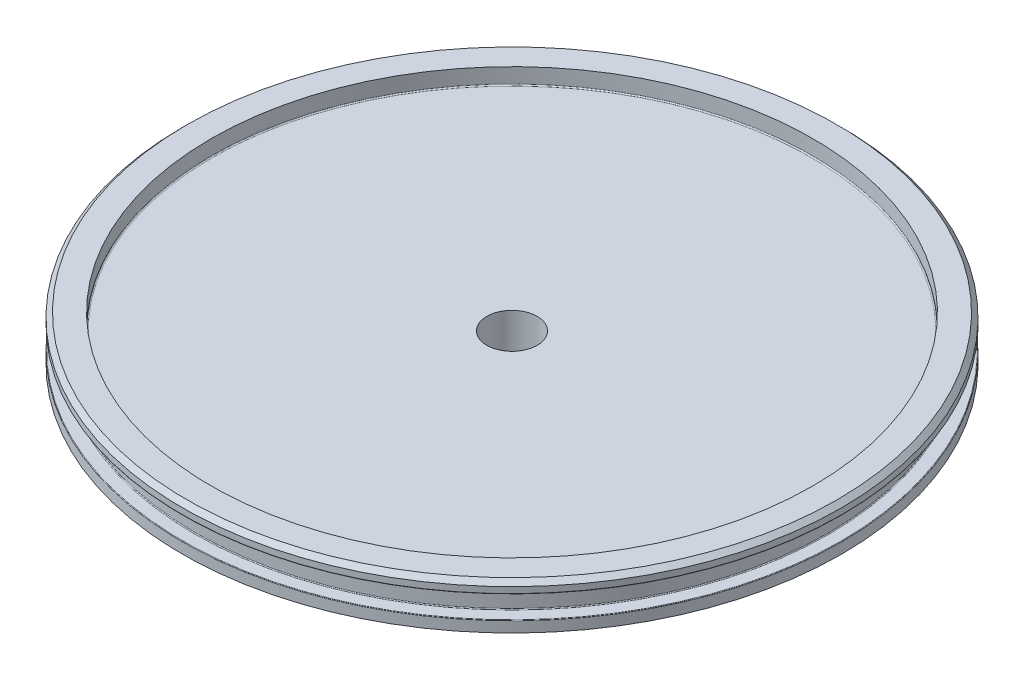
ISO-10303-21;
HEADER;
FILE_DESCRIPTION(('STEP AP214'),'2;1');
FILE_NAME('part.step','',(''),(''),'','','');
FILE_SCHEMA(('AUTOMOTIVE_DESIGN { 1 0 10303 214 1 1 1 1 }'));
ENDSEC;
DATA;
#1=APPLICATION_CONTEXT('core data for automotive mechanical design processes');
#2=APPLICATION_PROTOCOL_DEFINITION('international standard','automotive_design',2000,#1);
#3=PRODUCT_CONTEXT('',#1,'mechanical');
#4=PRODUCT('Part','Part','',(#3));
#5=PRODUCT_RELATED_PRODUCT_CATEGORY('part','',(#4));
#6=PRODUCT_DEFINITION_FORMATION('','',#4);
#7=PRODUCT_DEFINITION_CONTEXT('part definition',#1,'design');
#8=PRODUCT_DEFINITION('design','',#6,#7);
#9=PRODUCT_DEFINITION_SHAPE('','',#8);
#10=(LENGTH_UNIT() NAMED_UNIT(*) SI_UNIT(.MILLI.,.METRE.));
#11=(NAMED_UNIT(*) PLANE_ANGLE_UNIT() SI_UNIT($,.RADIAN.));
#12=(NAMED_UNIT(*) SI_UNIT($,.STERADIAN.) SOLID_ANGLE_UNIT());
#13=UNCERTAINTY_MEASURE_WITH_UNIT(LENGTH_MEASURE(1.E-05),#10,'distance_accuracy_value','');
#14=(GEOMETRIC_REPRESENTATION_CONTEXT(3) GLOBAL_UNCERTAINTY_ASSIGNED_CONTEXT((#13)) GLOBAL_UNIT_ASSIGNED_CONTEXT((#10,
#11,#12)) REPRESENTATION_CONTEXT('',''));
#15=CARTESIAN_POINT('',(0.,0.,0.));
#16=DIRECTION('',(0.,0.,1.));
#17=DIRECTION('',(1.,0.,0.));
#18=AXIS2_PLACEMENT_3D('',#15,#16,#17);
#19=CARTESIAN_POINT('',(0.,-2.54,0.));
#20=DIRECTION('',(0.,-1.,0.));
#21=DIRECTION('',(1.,0.,0.));
#22=AXIS2_PLACEMENT_3D('',#19,#20,#21);
#23=PLANE('',#22);
#24=CARTESIAN_POINT('',(0.,-2.54,0.));
#25=DIRECTION('',(0.,-1.,0.));
#26=DIRECTION('',(1.,0.,0.));
#27=AXIS2_PLACEMENT_3D('',#24,#25,#26);
#28=CIRCLE('',#27,65.913);
#29=CARTESIAN_POINT('',(65.913,-2.53999999999999,0.));
#30=VERTEX_POINT('',#29);
#31=EDGE_CURVE('E88',#30,#30,#28,.T.);
#32=ORIENTED_EDGE('',*,*,#31,.T.);
#33=EDGE_LOOP('',(#32));
#34=FACE_BOUND('',#33,.T.);
#35=CARTESIAN_POINT('',(0.,-2.54,0.));
#36=DIRECTION('',(0.,1.,0.));
#37=DIRECTION('',(0.,0.,1.));
#38=AXIS2_PLACEMENT_3D('',#35,#36,#37);
#39=CIRCLE('',#38,5.5626);
#40=CARTESIAN_POINT('',(0.,-2.54,5.5626));
#41=VERTEX_POINT('',#40);
#42=EDGE_CURVE('E124',#41,#41,#39,.T.);
#43=ORIENTED_EDGE('',*,*,#42,.T.);
#44=EDGE_LOOP('',(#43));
#45=FACE_BOUND('',#44,.T.);
#46=ADVANCED_FACE('F44',(#34,#45),#23,.T.);
#47=CARTESIAN_POINT('',(0.,0.,0.));
#48=DIRECTION('',(0.,1.,0.));
#49=DIRECTION('',(-1.,0.,0.));
#50=AXIS2_PLACEMENT_3D('',#47,#48,#49);
#51=PLANE('',#50);
#52=CARTESIAN_POINT('',(0.,0.,0.));
#53=DIRECTION('',(0.,1.,0.));
#54=DIRECTION('',(-1.,0.,0.));
#55=AXIS2_PLACEMENT_3D('',#52,#53,#54);
#56=CIRCLE('',#55,66.2178);
#57=CARTESIAN_POINT('',(-66.2178,0.,0.));
#58=VERTEX_POINT('',#57);
#59=EDGE_CURVE('E108',#58,#58,#56,.T.);
#60=ORIENTED_EDGE('',*,*,#59,.T.);
#61=EDGE_LOOP('',(#60));
#62=FACE_BOUND('',#61,.T.);
#63=CARTESIAN_POINT('',(0.,0.,0.));
#64=DIRECTION('',(0.,1.,0.));
#65=DIRECTION('',(-1.,0.,0.));
#66=AXIS2_PLACEMENT_3D('',#63,#64,#65);
#67=CIRCLE('',#66,72.898);
#68=CARTESIAN_POINT('',(-72.898,0.,0.));
#69=VERTEX_POINT('',#68);
#70=EDGE_CURVE('E116',#69,#69,#67,.T.);
#71=ORIENTED_EDGE('',*,*,#70,.F.);
#72=EDGE_LOOP('',(#71));
#73=FACE_BOUND('',#72,.T.);
#74=ADVANCED_FACE('F150',(#62,#73),#51,.F.);
#75=CARTESIAN_POINT('',(0.,48.1922132313012,0.));
#76=DIRECTION('',(0.,1.,0.));
#77=DIRECTION('',(-1.,0.,0.));
#78=AXIS2_PLACEMENT_3D('',#75,#76,#77);
#79=CYLINDRICAL_SURFACE('',#78,72.898);
#80=CARTESIAN_POINT('',(0.,2.33679999999999,0.));
#81=DIRECTION('',(0.,-1.,0.));
#82=DIRECTION('',(1.,0.,0.));
#83=AXIS2_PLACEMENT_3D('',#80,#81,#82);
#84=CIRCLE('',#83,72.898);
#85=CARTESIAN_POINT('',(72.898,2.3368,0.));
#86=VERTEX_POINT('',#85);
#87=EDGE_CURVE('E68',#86,#86,#84,.T.);
#88=ORIENTED_EDGE('',*,*,#87,.T.);
#89=EDGE_LOOP('',(#88));
#90=FACE_BOUND('',#89,.T.);
#91=ORIENTED_EDGE('',*,*,#70,.T.);
#92=EDGE_LOOP('',(#91));
#93=FACE_BOUND('',#92,.T.);
#94=ADVANCED_FACE('F158',(#90,#93),#79,.T.);
#95=CARTESIAN_POINT('',(72.898,2.4638,0.));
#96=DIRECTION('',(0.,-1.,0.));
#97=DIRECTION('',(1.,0.,0.));
#98=AXIS2_PLACEMENT_3D('',#95,#96,#97);
#99=PLANE('',#98);
#100=CARTESIAN_POINT('',(0.,2.46379999999999,0.));
#101=DIRECTION('',(0.,-1.,0.));
#102=DIRECTION('',(1.,0.,0.));
#103=AXIS2_PLACEMENT_3D('',#100,#101,#102);
#104=CIRCLE('',#103,72.771);
#105=CARTESIAN_POINT('',(72.771,2.4638,0.));
#106=VERTEX_POINT('',#105);
#107=EDGE_CURVE('E72',#106,#106,#104,.F.);
#108=ORIENTED_EDGE('',*,*,#107,.T.);
#109=EDGE_LOOP('',(#108));
#110=FACE_BOUND('',#109,.T.);
#111=CARTESIAN_POINT('',(0.,2.46379999999999,0.));
#112=DIRECTION('',(0.,-1.,0.));
#113=DIRECTION('',(1.,0.,0.));
#114=AXIS2_PLACEMENT_3D('',#111,#112,#113);
#115=CIRCLE('',#114,70.1548);
#116=CARTESIAN_POINT('',(70.1548,2.4638,0.));
#117=VERTEX_POINT('',#116);
#118=EDGE_CURVE('E92',#117,#117,#115,.T.);
#119=ORIENTED_EDGE('',*,*,#118,.T.);
#120=EDGE_LOOP('',(#119));
#121=FACE_BOUND('',#120,.T.);
#122=ADVANCED_FACE('F228',(#110,#121),#99,.F.);
#123=CARTESIAN_POINT('',(0.,48.1922132313012,0.));
#124=DIRECTION('',(0.,1.,0.));
#125=DIRECTION('',(-1.,0.,0.));
#126=AXIS2_PLACEMENT_3D('',#123,#124,#125);
#127=CYLINDRICAL_SURFACE('',#126,69.977);
#128=CARTESIAN_POINT('',(0.,7.26439999999999,0.));
#129=DIRECTION('',(0.,1.,0.));
#130=DIRECTION('',(-1.,0.,0.));
#131=AXIS2_PLACEMENT_3D('',#128,#129,#130);
#132=CIRCLE('',#131,69.977);
#133=CARTESIAN_POINT('',(-69.977,7.26439999999998,0.));
#134=VERTEX_POINT('',#133);
#135=EDGE_CURVE('E96',#134,#134,#132,.F.);
#136=ORIENTED_EDGE('',*,*,#135,.T.);
#137=EDGE_LOOP('',(#136));
#138=FACE_BOUND('',#137,.T.);
#139=CARTESIAN_POINT('',(0.,2.64159999999999,0.));
#140=DIRECTION('',(0.,-1.,0.));
#141=DIRECTION('',(1.,0.,0.));
#142=AXIS2_PLACEMENT_3D('',#139,#140,#141);
#143=CIRCLE('',#142,69.977);
#144=CARTESIAN_POINT('',(69.977,2.6416,0.));
#145=VERTEX_POINT('',#144);
#146=EDGE_CURVE('E100',#145,#145,#143,.F.);
#147=ORIENTED_EDGE('',*,*,#146,.T.);
#148=EDGE_LOOP('',(#147));
#149=FACE_BOUND('',#148,.T.);
#150=ADVANCED_FACE('F225',(#138,#149),#127,.T.);
#151=CARTESIAN_POINT('',(69.977,7.4422,0.));
#152=DIRECTION('',(0.,1.,0.));
#153=DIRECTION('',(-1.,0.,0.));
#154=AXIS2_PLACEMENT_3D('',#151,#152,#153);
#155=PLANE('',#154);
#156=CARTESIAN_POINT('',(0.,7.44219999999999,0.));
#157=DIRECTION('',(0.,1.,0.));
#158=DIRECTION('',(-1.,0.,0.));
#159=AXIS2_PLACEMENT_3D('',#156,#157,#158);
#160=CIRCLE('',#159,72.771);
#161=CARTESIAN_POINT('',(-72.771,7.44219999999998,0.));
#162=VERTEX_POINT('',#161);
#163=EDGE_CURVE('E76',#162,#162,#160,.F.);
#164=ORIENTED_EDGE('',*,*,#163,.T.);
#165=EDGE_LOOP('',(#164));
#166=FACE_BOUND('',#165,.T.);
#167=CARTESIAN_POINT('',(0.,7.44219999999999,0.));
#168=DIRECTION('',(0.,1.,0.));
#169=DIRECTION('',(-1.,0.,0.));
#170=AXIS2_PLACEMENT_3D('',#167,#168,#169);
#171=CIRCLE('',#170,70.1548);
#172=CARTESIAN_POINT('',(-70.1548,7.44219999999998,0.));
#173=VERTEX_POINT('',#172);
#174=EDGE_CURVE('E104',#173,#173,#171,.T.);
#175=ORIENTED_EDGE('',*,*,#174,.T.);
#176=EDGE_LOOP('',(#175));
#177=FACE_BOUND('',#176,.T.);
#178=ADVANCED_FACE('F219',(#166,#177),#155,.F.);
#179=CARTESIAN_POINT('',(0.,48.1922132313012,0.));
#180=DIRECTION('',(0.,1.,0.));
#181=DIRECTION('',(-1.,0.,0.));
#182=AXIS2_PLACEMENT_3D('',#179,#180,#181);
#183=CYLINDRICAL_SURFACE('',#182,72.898);
#184=CARTESIAN_POINT('',(0.,8.88999999999989,0.));
#185=DIRECTION('',(0.,-1.,0.));
#186=DIRECTION('',(1.,0.,0.));
#187=AXIS2_PLACEMENT_3D('',#184,#185,#186);
#188=CIRCLE('',#187,72.898);
#189=CARTESIAN_POINT('',(72.898,8.8899999999999,0.));
#190=VERTEX_POINT('',#189);
#191=EDGE_CURVE('E57',#190,#190,#188,.T.);
#192=ORIENTED_EDGE('',*,*,#191,.T.);
#193=EDGE_LOOP('',(#192));
#194=FACE_BOUND('',#193,.T.);
#195=CARTESIAN_POINT('',(0.,7.56919999999999,0.));
#196=DIRECTION('',(0.,1.,0.));
#197=DIRECTION('',(-1.,0.,0.));
#198=AXIS2_PLACEMENT_3D('',#195,#196,#197);
#199=CIRCLE('',#198,72.898);
#200=CARTESIAN_POINT('',(-72.898,7.56919999999998,0.));
#201=VERTEX_POINT('',#200);
#202=EDGE_CURVE('E80',#201,#201,#199,.T.);
#203=ORIENTED_EDGE('',*,*,#202,.T.);
#204=EDGE_LOOP('',(#203));
#205=FACE_BOUND('',#204,.T.);
#206=ADVANCED_FACE('F212',(#194,#205),#183,.T.);
#207=CARTESIAN_POINT('',(72.898,9.906,0.));
#208=DIRECTION('',(0.,-1.,0.));
#209=DIRECTION('',(1.,0.,0.));
#210=AXIS2_PLACEMENT_3D('',#207,#208,#209);
#211=PLANE('',#210);
#212=CARTESIAN_POINT('',(0.,9.90599999999999,0.));
#213=DIRECTION('',(0.,-1.,0.));
#214=DIRECTION('',(1.,0.,0.));
#215=AXIS2_PLACEMENT_3D('',#212,#213,#214);
#216=CIRCLE('',#215,71.8819999999999);
#217=CARTESIAN_POINT('',(71.8819999999999,9.906,0.));
#218=VERTEX_POINT('',#217);
#219=EDGE_CURVE('E62',#218,#218,#216,.F.);
#220=ORIENTED_EDGE('',*,*,#219,.T.);
#221=EDGE_LOOP('',(#220));
#222=FACE_BOUND('',#221,.T.);
#223=CARTESIAN_POINT('',(0.,9.90599999999999,0.));
#224=DIRECTION('',(0.,1.,0.));
#225=DIRECTION('',(-1.,0.,0.));
#226=AXIS2_PLACEMENT_3D('',#223,#224,#225);
#227=CIRCLE('',#226,66.548);
#228=CARTESIAN_POINT('',(-66.548,9.90599999999998,0.));
#229=VERTEX_POINT('',#228);
#230=EDGE_CURVE('E120',#229,#229,#227,.T.);
#231=ORIENTED_EDGE('',*,*,#230,.F.);
#232=EDGE_LOOP('',(#231));
#233=FACE_BOUND('',#232,.T.);
#234=ADVANCED_FACE('F147',(#222,#233),#211,.F.);
#235=CARTESIAN_POINT('',(0.,48.1922132313012,0.));
#236=DIRECTION('',(0.,1.,0.));
#237=DIRECTION('',(-1.,0.,0.));
#238=AXIS2_PLACEMENT_3D('',#235,#236,#237);
#239=CYLINDRICAL_SURFACE('',#238,66.548);
#240=CARTESIAN_POINT('',(0.,6.604,0.));
#241=DIRECTION('',(0.,-1.,0.));
#242=DIRECTION('',(1.,0.,0.));
#243=AXIS2_PLACEMENT_3D('',#240,#241,#242);
#244=CIRCLE('',#243,66.548);
#245=CARTESIAN_POINT('',(66.548,6.60400000000001,0.));
#246=VERTEX_POINT('',#245);
#247=EDGE_CURVE('E10',#246,#246,#244,.T.);
#248=ORIENTED_EDGE('',*,*,#247,.T.);
#249=EDGE_LOOP('',(#248));
#250=FACE_BOUND('',#249,.T.);
#251=ORIENTED_EDGE('',*,*,#230,.T.);
#252=EDGE_LOOP('',(#251));
#253=FACE_BOUND('',#252,.T.);
#254=ADVANCED_FACE('F138',(#250,#253),#239,.F.);
#255=CARTESIAN_POINT('',(66.548,6.35,0.));
#256=DIRECTION('',(0.,-1.,0.));
#257=DIRECTION('',(1.,0.,0.));
#258=AXIS2_PLACEMENT_3D('',#255,#256,#257);
#259=PLANE('',#258);
#260=CARTESIAN_POINT('',(0.,6.35,0.));
#261=DIRECTION('',(0.,-1.,0.));
#262=DIRECTION('',(1.,0.,0.));
#263=AXIS2_PLACEMENT_3D('',#260,#261,#262);
#264=CIRCLE('',#263,66.294);
#265=CARTESIAN_POINT('',(66.294,6.35,0.));
#266=VERTEX_POINT('',#265);
#267=EDGE_CURVE('E52',#266,#266,#264,.F.);
#268=ORIENTED_EDGE('',*,*,#267,.T.);
#269=EDGE_LOOP('',(#268));
#270=FACE_BOUND('',#269,.T.);
#271=CARTESIAN_POINT('',(0.,6.35,0.));
#272=DIRECTION('',(0.,1.,0.));
#273=DIRECTION('',(0.,0.,1.));
#274=AXIS2_PLACEMENT_3D('',#271,#272,#273);
#275=CIRCLE('',#274,5.56259999999999);
#276=CARTESIAN_POINT('',(0.,6.35,5.56259999999999));
#277=VERTEX_POINT('',#276);
#278=EDGE_CURVE('E128',#277,#277,#275,.T.);
#279=ORIENTED_EDGE('',*,*,#278,.F.);
#280=EDGE_LOOP('',(#279));
#281=FACE_BOUND('',#280,.T.);
#282=ADVANCED_FACE('F135',(#270,#281),#259,.F.);
#283=CARTESIAN_POINT('',(0.,-2.54,0.));
#284=DIRECTION('',(0.,1.,0.));
#285=DIRECTION('',(-1.,0.,0.));
#286=AXIS2_PLACEMENT_3D('',#283,#284,#285);
#287=CYLINDRICAL_SURFACE('',#286,66.04);
#288=CARTESIAN_POINT('',(0.,-2.413,0.));
#289=DIRECTION('',(0.,-1.,0.));
#290=DIRECTION('',(1.,0.,0.));
#291=AXIS2_PLACEMENT_3D('',#288,#289,#290);
#292=CIRCLE('',#291,66.04);
#293=CARTESIAN_POINT('',(66.04,-2.41299999999999,0.));
#294=VERTEX_POINT('',#293);
#295=EDGE_CURVE('E84',#294,#294,#292,.F.);
#296=ORIENTED_EDGE('',*,*,#295,.T.);
#297=EDGE_LOOP('',(#296));
#298=FACE_BOUND('',#297,.T.);
#299=CARTESIAN_POINT('',(0.,-0.177800000000004,0.));
#300=DIRECTION('',(0.,1.,0.));
#301=DIRECTION('',(-1.,0.,0.));
#302=AXIS2_PLACEMENT_3D('',#299,#300,#301);
#303=CIRCLE('',#302,66.04);
#304=CARTESIAN_POINT('',(-66.04,-0.177800000000012,0.));
#305=VERTEX_POINT('',#304);
#306=EDGE_CURVE('E112',#305,#305,#303,.F.);
#307=ORIENTED_EDGE('',*,*,#306,.T.);
#308=EDGE_LOOP('',(#307));
#309=FACE_BOUND('',#308,.T.);
#310=ADVANCED_FACE('F137',(#298,#309),#287,.T.);
#311=CARTESIAN_POINT('',(0.,6.35,0.));
#312=DIRECTION('',(0.,1.,0.));
#313=DIRECTION('',(0.,0.,1.));
#314=AXIS2_PLACEMENT_3D('',#311,#312,#313);
#315=CYLINDRICAL_SURFACE('',#314,5.56259999999999);
#316=ORIENTED_EDGE('',*,*,#42,.F.);
#317=EDGE_LOOP('',(#316));
#318=FACE_BOUND('',#317,.T.);
#319=ORIENTED_EDGE('',*,*,#278,.T.);
#320=EDGE_LOOP('',(#319));
#321=FACE_BOUND('',#320,.T.);
#322=ADVANCED_FACE('F133',(#318,#321),#315,.F.);
#323=CARTESIAN_POINT('',(0.,-0.177800000000004,0.));
#324=DIRECTION('',(0.,1.,0.));
#325=DIRECTION('',(-1.,0.,0.));
#326=AXIS2_PLACEMENT_3D('',#323,#324,#325);
#327=TOROIDAL_SURFACE('',#326,66.2178,0.1778);
#328=ORIENTED_EDGE('',*,*,#59,.F.);
#329=EDGE_LOOP('',(#328));
#330=FACE_BOUND('',#329,.T.);
#331=ORIENTED_EDGE('',*,*,#306,.F.);
#332=EDGE_LOOP('',(#331));
#333=FACE_BOUND('',#332,.T.);
#334=ADVANCED_FACE('F164',(#330,#333),#327,.F.);
#335=CARTESIAN_POINT('',(0.,7.26439999999999,0.));
#336=DIRECTION('',(0.,1.,0.));
#337=DIRECTION('',(-1.,0.,0.));
#338=AXIS2_PLACEMENT_3D('',#335,#336,#337);
#339=TOROIDAL_SURFACE('',#338,70.1548,0.1778);
#340=ORIENTED_EDGE('',*,*,#135,.F.);
#341=EDGE_LOOP('',(#340));
#342=FACE_BOUND('',#341,.T.);
#343=ORIENTED_EDGE('',*,*,#174,.F.);
#344=EDGE_LOOP('',(#343));
#345=FACE_BOUND('',#344,.T.);
#346=ADVANCED_FACE('F169',(#342,#345),#339,.F.);
#347=CARTESIAN_POINT('',(0.,2.64159999999999,0.));
#348=DIRECTION('',(0.,-1.,0.));
#349=DIRECTION('',(1.,0.,0.));
#350=AXIS2_PLACEMENT_3D('',#347,#348,#349);
#351=TOROIDAL_SURFACE('',#350,70.1548,0.1778);
#352=ORIENTED_EDGE('',*,*,#118,.F.);
#353=EDGE_LOOP('',(#352));
#354=FACE_BOUND('',#353,.T.);
#355=ORIENTED_EDGE('',*,*,#146,.F.);
#356=EDGE_LOOP('',(#355));
#357=FACE_BOUND('',#356,.T.);
#358=ADVANCED_FACE('F177',(#354,#357),#351,.F.);
#359=CARTESIAN_POINT('',(0.,-2.413,0.));
#360=DIRECTION('',(0.,-1.,0.));
#361=DIRECTION('',(1.,0.,0.));
#362=AXIS2_PLACEMENT_3D('',#359,#360,#361);
#363=TOROIDAL_SURFACE('',#362,65.913,0.127);
#364=ORIENTED_EDGE('',*,*,#295,.F.);
#365=EDGE_LOOP('',(#364));
#366=FACE_BOUND('',#365,.T.);
#367=ORIENTED_EDGE('',*,*,#31,.F.);
#368=EDGE_LOOP('',(#367));
#369=FACE_BOUND('',#368,.T.);
#370=ADVANCED_FACE('F185',(#366,#369),#363,.T.);
#371=CARTESIAN_POINT('',(0.,7.56919999999999,0.));
#372=DIRECTION('',(0.,1.,0.));
#373=DIRECTION('',(-1.,0.,0.));
#374=AXIS2_PLACEMENT_3D('',#371,#372,#373);
#375=TOROIDAL_SURFACE('',#374,72.771,0.127);
#376=ORIENTED_EDGE('',*,*,#163,.F.);
#377=EDGE_LOOP('',(#376));
#378=FACE_BOUND('',#377,.T.);
#379=ORIENTED_EDGE('',*,*,#202,.F.);
#380=EDGE_LOOP('',(#379));
#381=FACE_BOUND('',#380,.T.);
#382=ADVANCED_FACE('F189',(#378,#381),#375,.T.);
#383=CARTESIAN_POINT('',(0.,2.33679999999999,0.));
#384=DIRECTION('',(0.,-1.,0.));
#385=DIRECTION('',(1.,0.,0.));
#386=AXIS2_PLACEMENT_3D('',#383,#384,#385);
#387=TOROIDAL_SURFACE('',#386,72.771,0.127);
#388=ORIENTED_EDGE('',*,*,#87,.F.);
#389=EDGE_LOOP('',(#388));
#390=FACE_BOUND('',#389,.T.);
#391=ORIENTED_EDGE('',*,*,#107,.F.);
#392=EDGE_LOOP('',(#391));
#393=FACE_BOUND('',#392,.T.);
#394=ADVANCED_FACE('F193',(#390,#393),#387,.T.);
#395=CARTESIAN_POINT('',(0.,9.90599999999999,0.));
#396=DIRECTION('',(0.,-1.,0.));
#397=DIRECTION('',(1.,0.,0.));
#398=AXIS2_PLACEMENT_3D('',#395,#396,#397);
#399=CONICAL_SURFACE('',#398,71.8819999999999,0.785398163397448);
#400=ORIENTED_EDGE('',*,*,#191,.F.);
#401=EDGE_LOOP('',(#400));
#402=FACE_BOUND('',#401,.T.);
#403=ORIENTED_EDGE('',*,*,#219,.F.);
#404=EDGE_LOOP('',(#403));
#405=FACE_BOUND('',#404,.T.);
#406=ADVANCED_FACE('F196',(#402,#405),#399,.T.);
#407=CARTESIAN_POINT('',(0.,6.604,0.));
#408=DIRECTION('',(0.,-1.,0.));
#409=DIRECTION('',(1.,0.,0.));
#410=AXIS2_PLACEMENT_3D('',#407,#408,#409);
#411=TOROIDAL_SURFACE('',#410,66.294,0.254);
#412=ORIENTED_EDGE('',*,*,#247,.F.);
#413=EDGE_LOOP('',(#412));
#414=FACE_BOUND('',#413,.T.);
#415=ORIENTED_EDGE('',*,*,#267,.F.);
#416=EDGE_LOOP('',(#415));
#417=FACE_BOUND('',#416,.T.);
#418=ADVANCED_FACE('F46',(#414,#417),#411,.F.);
#419=CLOSED_SHELL('',(#46,#74,#94,#122,#150,#178,#206,#234,#254,#282,#310,#322,#334,#346,#358,
#370,#382,#394,#406,#418));
#420=MANIFOLD_SOLID_BREP('B2',#419);
#421=ADVANCED_BREP_SHAPE_REPRESENTATION('',(#18,#420),#14);
#422=SHAPE_DEFINITION_REPRESENTATION(#9,#421);
ENDSEC;
END-ISO-10303-21;
